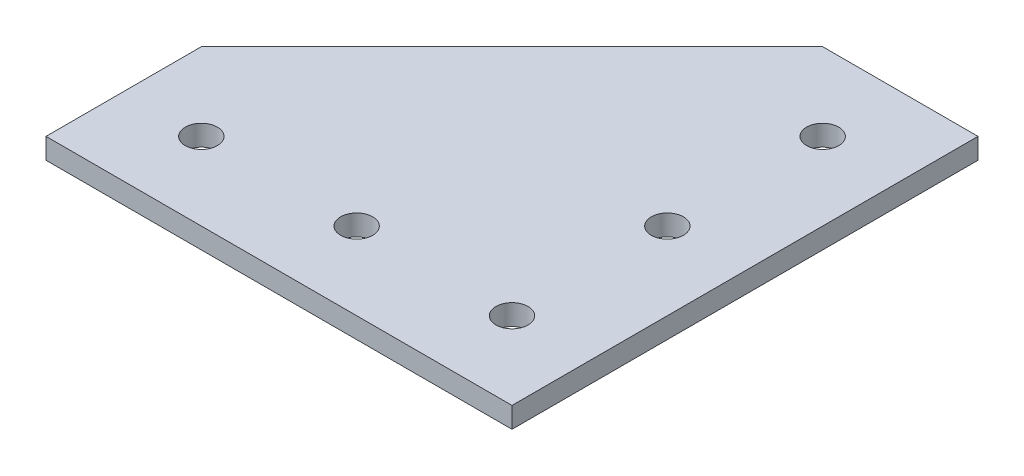
ISO-10303-21;
HEADER;
FILE_DESCRIPTION(('STEP AP214'),'2;1');
FILE_NAME('part.step','',(''),(''),'','','');
FILE_SCHEMA(('AUTOMOTIVE_DESIGN { 1 0 10303 214 1 1 1 1 }'));
ENDSEC;
DATA;
#1=APPLICATION_CONTEXT('core data for automotive mechanical design processes');
#2=APPLICATION_PROTOCOL_DEFINITION('international standard','automotive_design',2000,#1);
#3=PRODUCT_CONTEXT('',#1,'mechanical');
#4=PRODUCT('Part','Part','',(#3));
#5=PRODUCT_RELATED_PRODUCT_CATEGORY('part','',(#4));
#6=PRODUCT_DEFINITION_FORMATION('','',#4);
#7=PRODUCT_DEFINITION_CONTEXT('part definition',#1,'design');
#8=PRODUCT_DEFINITION('design','',#6,#7);
#9=PRODUCT_DEFINITION_SHAPE('','',#8);
#10=(LENGTH_UNIT() NAMED_UNIT(*) SI_UNIT(.MILLI.,.METRE.));
#11=(NAMED_UNIT(*) PLANE_ANGLE_UNIT() SI_UNIT($,.RADIAN.));
#12=(NAMED_UNIT(*) SI_UNIT($,.STERADIAN.) SOLID_ANGLE_UNIT());
#13=UNCERTAINTY_MEASURE_WITH_UNIT(LENGTH_MEASURE(1.E-05),#10,'distance_accuracy_value','');
#14=(GEOMETRIC_REPRESENTATION_CONTEXT(3) GLOBAL_UNCERTAINTY_ASSIGNED_CONTEXT((#13)) GLOBAL_UNIT_ASSIGNED_CONTEXT((#10,
#11,#12)) REPRESENTATION_CONTEXT('',''));
#15=CARTESIAN_POINT('',(0.,0.,0.));
#16=DIRECTION('',(0.,0.,1.));
#17=DIRECTION('',(1.,0.,0.));
#18=AXIS2_PLACEMENT_3D('',#15,#16,#17);
#19=CARTESIAN_POINT('',(0.,4.,0.));
#20=DIRECTION('',(0.,-1.,0.));
#21=DIRECTION('',(0.,0.,-1.));
#22=AXIS2_PLACEMENT_3D('',#19,#20,#21);
#23=PLANE('',#22);
#24=DIRECTION('',(-1.,0.,0.));
#25=VECTOR('',#24,1.);
#26=CARTESIAN_POINT('',(0.,4.,0.));
#27=LINE('',#26,#25);
#28=CARTESIAN_POINT('',(0.,4.,0.));
#29=VERTEX_POINT('',#28);
#30=CARTESIAN_POINT('',(-30.,4.,0.));
#31=VERTEX_POINT('',#30);
#32=EDGE_CURVE('E123',#29,#31,#27,.T.);
#33=ORIENTED_EDGE('',*,*,#32,.T.);
#34=DIRECTION('',(-0.707106781186547,0.,0.707106781186548));
#35=VECTOR('',#34,1.);
#36=CARTESIAN_POINT('',(-30.,4.,0.));
#37=LINE('',#36,#35);
#38=CARTESIAN_POINT('',(-90.,4.,60.));
#39=VERTEX_POINT('',#38);
#40=EDGE_CURVE('E90',#31,#39,#37,.T.);
#41=ORIENTED_EDGE('',*,*,#40,.T.);
#42=DIRECTION('',(0.,0.,1.));
#43=VECTOR('',#42,1.);
#44=CARTESIAN_POINT('',(-90.,4.,90.));
#45=LINE('',#44,#43);
#46=CARTESIAN_POINT('',(-90.,4.,90.));
#47=VERTEX_POINT('',#46);
#48=EDGE_CURVE('E94',#39,#47,#45,.T.);
#49=ORIENTED_EDGE('',*,*,#48,.T.);
#50=DIRECTION('',(1.,0.,0.));
#51=VECTOR('',#50,1.);
#52=CARTESIAN_POINT('',(0.,4.,90.));
#53=LINE('',#52,#51);
#54=CARTESIAN_POINT('',(0.,4.,90.));
#55=VERTEX_POINT('',#54);
#56=EDGE_CURVE('E98',#47,#55,#53,.T.);
#57=ORIENTED_EDGE('',*,*,#56,.T.);
#58=DIRECTION('',(0.,0.,-1.));
#59=VECTOR('',#58,1.);
#60=CARTESIAN_POINT('',(0.,4.,0.));
#61=LINE('',#60,#59);
#62=EDGE_CURVE('E56',#55,#29,#61,.T.);
#63=ORIENTED_EDGE('',*,*,#62,.T.);
#64=EDGE_LOOP('',(#33,#41,#49,#57,#63));
#65=FACE_BOUND('',#64,.T.);
#66=CARTESIAN_POINT('',(-15.,4.,15.));
#67=DIRECTION('',(0.,1.,0.));
#68=DIRECTION('',(0.,0.,1.));
#69=AXIS2_PLACEMENT_3D('',#66,#67,#68);
#70=CIRCLE('',#69,3.1);
#71=CARTESIAN_POINT('',(-15.,4.,18.1));
#72=VERTEX_POINT('',#71);
#73=EDGE_CURVE('E118',#72,#72,#70,.T.);
#74=ORIENTED_EDGE('',*,*,#73,.F.);
#75=EDGE_LOOP('',(#74));
#76=FACE_BOUND('',#75,.T.);
#77=CARTESIAN_POINT('',(-15.,4.,45.));
#78=DIRECTION('',(0.,1.,0.));
#79=DIRECTION('',(0.,0.,1.));
#80=AXIS2_PLACEMENT_3D('',#77,#78,#79);
#81=CIRCLE('',#80,3.1);
#82=CARTESIAN_POINT('',(-15.,4.,48.1));
#83=VERTEX_POINT('',#82);
#84=EDGE_CURVE('E192',#83,#83,#81,.T.);
#85=ORIENTED_EDGE('',*,*,#84,.F.);
#86=EDGE_LOOP('',(#85));
#87=FACE_BOUND('',#86,.T.);
#88=CARTESIAN_POINT('',(-15.,4.,75.));
#89=DIRECTION('',(0.,1.,0.));
#90=DIRECTION('',(0.,0.,1.));
#91=AXIS2_PLACEMENT_3D('',#88,#89,#90);
#92=CIRCLE('',#91,3.1);
#93=CARTESIAN_POINT('',(-15.,4.,78.1));
#94=VERTEX_POINT('',#93);
#95=EDGE_CURVE('E186',#94,#94,#92,.T.);
#96=ORIENTED_EDGE('',*,*,#95,.F.);
#97=EDGE_LOOP('',(#96));
#98=FACE_BOUND('',#97,.T.);
#99=CARTESIAN_POINT('',(-45.,4.,75.0000000000002));
#100=DIRECTION('',(0.,1.,0.));
#101=DIRECTION('',(0.,0.,1.));
#102=AXIS2_PLACEMENT_3D('',#99,#100,#101);
#103=CIRCLE('',#102,3.1);
#104=CARTESIAN_POINT('',(-45.,4.,78.1000000000002));
#105=VERTEX_POINT('',#104);
#106=EDGE_CURVE('E180',#105,#105,#103,.T.);
#107=ORIENTED_EDGE('',*,*,#106,.F.);
#108=EDGE_LOOP('',(#107));
#109=FACE_BOUND('',#108,.T.);
#110=CARTESIAN_POINT('',(-75.,4.,75.0000000000004));
#111=DIRECTION('',(0.,1.,0.));
#112=DIRECTION('',(0.,0.,1.));
#113=AXIS2_PLACEMENT_3D('',#110,#111,#112);
#114=CIRCLE('',#113,3.09999999999999);
#115=CARTESIAN_POINT('',(-75.,4.,78.1000000000004));
#116=VERTEX_POINT('',#115);
#117=EDGE_CURVE('E171',#116,#116,#114,.T.);
#118=ORIENTED_EDGE('',*,*,#117,.F.);
#119=EDGE_LOOP('',(#118));
#120=FACE_BOUND('',#119,.T.);
#121=ADVANCED_FACE('F39',(#65,#76,#87,#98,#109,#120),#23,.F.);
#122=CARTESIAN_POINT('',(0.,0.,0.));
#123=DIRECTION('',(0.,-1.,0.));
#124=DIRECTION('',(0.,0.,-1.));
#125=AXIS2_PLACEMENT_3D('',#122,#123,#124);
#126=PLANE('',#125);
#127=CARTESIAN_POINT('',(-45.,0.,75.0000000000002));
#128=DIRECTION('',(0.,1.,0.));
#129=DIRECTION('',(0.,0.,1.));
#130=AXIS2_PLACEMENT_3D('',#127,#128,#129);
#131=CIRCLE('',#130,3.1);
#132=CARTESIAN_POINT('',(-45.,0.,78.1000000000002));
#133=VERTEX_POINT('',#132);
#134=EDGE_CURVE('E177',#133,#133,#131,.T.);
#135=ORIENTED_EDGE('',*,*,#134,.T.);
#136=EDGE_LOOP('',(#135));
#137=FACE_BOUND('',#136,.T.);
#138=CARTESIAN_POINT('',(-15.,0.,45.));
#139=DIRECTION('',(0.,1.,0.));
#140=DIRECTION('',(0.,0.,1.));
#141=AXIS2_PLACEMENT_3D('',#138,#139,#140);
#142=CIRCLE('',#141,3.1);
#143=CARTESIAN_POINT('',(-15.,0.,48.1));
#144=VERTEX_POINT('',#143);
#145=EDGE_CURVE('E189',#144,#144,#142,.T.);
#146=ORIENTED_EDGE('',*,*,#145,.T.);
#147=EDGE_LOOP('',(#146));
#148=FACE_BOUND('',#147,.T.);
#149=DIRECTION('',(-1.,0.,0.));
#150=VECTOR('',#149,1.);
#151=CARTESIAN_POINT('',(0.,0.,0.));
#152=LINE('',#151,#150);
#153=CARTESIAN_POINT('',(0.,0.,0.));
#154=VERTEX_POINT('',#153);
#155=CARTESIAN_POINT('',(-30.,0.,0.));
#156=VERTEX_POINT('',#155);
#157=EDGE_CURVE('E114',#154,#156,#152,.T.);
#158=ORIENTED_EDGE('',*,*,#157,.F.);
#159=DIRECTION('',(0.,0.,-1.));
#160=VECTOR('',#159,1.);
#161=CARTESIAN_POINT('',(0.,0.,0.));
#162=LINE('',#161,#160);
#163=CARTESIAN_POINT('',(0.,0.,90.));
#164=VERTEX_POINT('',#163);
#165=EDGE_CURVE('E82',#164,#154,#162,.T.);
#166=ORIENTED_EDGE('',*,*,#165,.F.);
#167=DIRECTION('',(1.,0.,0.));
#168=VECTOR('',#167,1.);
#169=CARTESIAN_POINT('',(0.,0.,90.));
#170=LINE('',#169,#168);
#171=CARTESIAN_POINT('',(-90.,0.,90.));
#172=VERTEX_POINT('',#171);
#173=EDGE_CURVE('E76',#172,#164,#170,.T.);
#174=ORIENTED_EDGE('',*,*,#173,.F.);
#175=DIRECTION('',(0.,0.,1.));
#176=VECTOR('',#175,1.);
#177=CARTESIAN_POINT('',(-90.,0.,90.));
#178=LINE('',#177,#176);
#179=CARTESIAN_POINT('',(-90.,0.,60.));
#180=VERTEX_POINT('',#179);
#181=EDGE_CURVE('E105',#180,#172,#178,.T.);
#182=ORIENTED_EDGE('',*,*,#181,.F.);
#183=DIRECTION('',(-0.707106781186547,0.,0.707106781186548));
#184=VECTOR('',#183,1.);
#185=CARTESIAN_POINT('',(-30.,0.,0.));
#186=LINE('',#185,#184);
#187=EDGE_CURVE('E117',#156,#180,#186,.T.);
#188=ORIENTED_EDGE('',*,*,#187,.F.);
#189=EDGE_LOOP('',(#158,#166,#174,#182,#188));
#190=FACE_BOUND('',#189,.T.);
#191=CARTESIAN_POINT('',(-15.,0.,15.));
#192=DIRECTION('',(0.,1.,0.));
#193=DIRECTION('',(0.,0.,1.));
#194=AXIS2_PLACEMENT_3D('',#191,#192,#193);
#195=CIRCLE('',#194,3.1);
#196=CARTESIAN_POINT('',(-15.,0.,18.1));
#197=VERTEX_POINT('',#196);
#198=EDGE_CURVE('E195',#197,#197,#195,.T.);
#199=ORIENTED_EDGE('',*,*,#198,.T.);
#200=EDGE_LOOP('',(#199));
#201=FACE_BOUND('',#200,.T.);
#202=CARTESIAN_POINT('',(-15.,0.,75.));
#203=DIRECTION('',(0.,1.,0.));
#204=DIRECTION('',(0.,0.,1.));
#205=AXIS2_PLACEMENT_3D('',#202,#203,#204);
#206=CIRCLE('',#205,3.1);
#207=CARTESIAN_POINT('',(-15.,0.,78.1));
#208=VERTEX_POINT('',#207);
#209=EDGE_CURVE('E183',#208,#208,#206,.T.);
#210=ORIENTED_EDGE('',*,*,#209,.T.);
#211=EDGE_LOOP('',(#210));
#212=FACE_BOUND('',#211,.T.);
#213=CARTESIAN_POINT('',(-75.,0.,75.0000000000004));
#214=DIRECTION('',(0.,1.,0.));
#215=DIRECTION('',(0.,0.,1.));
#216=AXIS2_PLACEMENT_3D('',#213,#214,#215);
#217=CIRCLE('',#216,3.09999999999999);
#218=CARTESIAN_POINT('',(-75.,0.,78.1000000000004));
#219=VERTEX_POINT('',#218);
#220=EDGE_CURVE('E174',#219,#219,#217,.T.);
#221=ORIENTED_EDGE('',*,*,#220,.T.);
#222=EDGE_LOOP('',(#221));
#223=FACE_BOUND('',#222,.T.);
#224=ADVANCED_FACE('F127',(#137,#148,#190,#201,#212,#223),#126,.T.);
#225=CARTESIAN_POINT('',(0.,4.,0.));
#226=DIRECTION('',(0.,0.,1.));
#227=DIRECTION('',(1.,0.,0.));
#228=AXIS2_PLACEMENT_3D('',#225,#226,#227);
#229=PLANE('',#228);
#230=ORIENTED_EDGE('',*,*,#157,.T.);
#231=DIRECTION('',(0.,-1.,0.));
#232=VECTOR('',#231,1.);
#233=CARTESIAN_POINT('',(-30.,4.,0.));
#234=LINE('',#233,#232);
#235=EDGE_CURVE('E11',#31,#156,#234,.T.);
#236=ORIENTED_EDGE('',*,*,#235,.F.);
#237=ORIENTED_EDGE('',*,*,#32,.F.);
#238=DIRECTION('',(0.,-1.,0.));
#239=VECTOR('',#238,1.);
#240=CARTESIAN_POINT('',(0.,4.,0.));
#241=LINE('',#240,#239);
#242=EDGE_CURVE('E110',#29,#154,#241,.T.);
#243=ORIENTED_EDGE('',*,*,#242,.T.);
#244=EDGE_LOOP('',(#230,#236,#237,#243));
#245=FACE_BOUND('',#244,.T.);
#246=ADVANCED_FACE('F41',(#245),#229,.F.);
#247=CARTESIAN_POINT('',(-30.,4.,0.));
#248=DIRECTION('',(0.707106781186548,0.,0.707106781186547));
#249=DIRECTION('',(0.707106781186547,0.,-0.707106781186548));
#250=AXIS2_PLACEMENT_3D('',#247,#248,#249);
#251=PLANE('',#250);
#252=ORIENTED_EDGE('',*,*,#187,.T.);
#253=DIRECTION('',(0.,-1.,0.));
#254=VECTOR('',#253,1.);
#255=CARTESIAN_POINT('',(-90.,4.,60.));
#256=LINE('',#255,#254);
#257=EDGE_CURVE('E48',#39,#180,#256,.T.);
#258=ORIENTED_EDGE('',*,*,#257,.F.);
#259=ORIENTED_EDGE('',*,*,#40,.F.);
#260=ORIENTED_EDGE('',*,*,#235,.T.);
#261=EDGE_LOOP('',(#252,#258,#259,#260));
#262=FACE_BOUND('',#261,.T.);
#263=ADVANCED_FACE('F260',(#262),#251,.F.);
#264=CARTESIAN_POINT('',(-90.,4.,90.));
#265=DIRECTION('',(1.,0.,0.));
#266=DIRECTION('',(0.,0.,-1.));
#267=AXIS2_PLACEMENT_3D('',#264,#265,#266);
#268=PLANE('',#267);
#269=ORIENTED_EDGE('',*,*,#181,.T.);
#270=DIRECTION('',(0.,-1.,0.));
#271=VECTOR('',#270,1.);
#272=CARTESIAN_POINT('',(-90.,4.,90.));
#273=LINE('',#272,#271);
#274=EDGE_CURVE('E102',#47,#172,#273,.T.);
#275=ORIENTED_EDGE('',*,*,#274,.F.);
#276=ORIENTED_EDGE('',*,*,#48,.F.);
#277=ORIENTED_EDGE('',*,*,#257,.T.);
#278=EDGE_LOOP('',(#269,#275,#276,#277));
#279=FACE_BOUND('',#278,.T.);
#280=ADVANCED_FACE('F103',(#279),#268,.F.);
#281=CARTESIAN_POINT('',(0.,4.,90.));
#282=DIRECTION('',(0.,0.,-1.));
#283=DIRECTION('',(-1.,0.,0.));
#284=AXIS2_PLACEMENT_3D('',#281,#282,#283);
#285=PLANE('',#284);
#286=ORIENTED_EDGE('',*,*,#173,.T.);
#287=DIRECTION('',(0.,-1.,0.));
#288=VECTOR('',#287,1.);
#289=CARTESIAN_POINT('',(0.,4.,90.));
#290=LINE('',#289,#288);
#291=EDGE_CURVE('E106',#55,#164,#290,.T.);
#292=ORIENTED_EDGE('',*,*,#291,.F.);
#293=ORIENTED_EDGE('',*,*,#56,.F.);
#294=ORIENTED_EDGE('',*,*,#274,.T.);
#295=EDGE_LOOP('',(#286,#292,#293,#294));
#296=FACE_BOUND('',#295,.T.);
#297=ADVANCED_FACE('F108',(#296),#285,.F.);
#298=CARTESIAN_POINT('',(0.,4.,0.));
#299=DIRECTION('',(-1.,0.,0.));
#300=DIRECTION('',(0.,0.,1.));
#301=AXIS2_PLACEMENT_3D('',#298,#299,#300);
#302=PLANE('',#301);
#303=ORIENTED_EDGE('',*,*,#165,.T.);
#304=ORIENTED_EDGE('',*,*,#242,.F.);
#305=ORIENTED_EDGE('',*,*,#62,.F.);
#306=ORIENTED_EDGE('',*,*,#291,.T.);
#307=EDGE_LOOP('',(#303,#304,#305,#306));
#308=FACE_BOUND('',#307,.T.);
#309=ADVANCED_FACE('F132',(#308),#302,.F.);
#310=CARTESIAN_POINT('',(-15.,4.,15.));
#311=DIRECTION('',(0.,-1.,0.));
#312=DIRECTION('',(0.,0.,-1.));
#313=AXIS2_PLACEMENT_3D('',#310,#311,#312);
#314=CYLINDRICAL_SURFACE('',#313,3.1);
#315=ORIENTED_EDGE('',*,*,#73,.T.);
#316=EDGE_LOOP('',(#315));
#317=FACE_BOUND('',#316,.T.);
#318=ORIENTED_EDGE('',*,*,#198,.F.);
#319=EDGE_LOOP('',(#318));
#320=FACE_BOUND('',#319,.T.);
#321=ADVANCED_FACE('F134',(#317,#320),#314,.F.);
#322=CARTESIAN_POINT('',(-15.,4.,45.));
#323=DIRECTION('',(0.,-1.,0.));
#324=DIRECTION('',(0.,0.,-1.));
#325=AXIS2_PLACEMENT_3D('',#322,#323,#324);
#326=CYLINDRICAL_SURFACE('',#325,3.1);
#327=ORIENTED_EDGE('',*,*,#84,.T.);
#328=EDGE_LOOP('',(#327));
#329=FACE_BOUND('',#328,.T.);
#330=ORIENTED_EDGE('',*,*,#145,.F.);
#331=EDGE_LOOP('',(#330));
#332=FACE_BOUND('',#331,.T.);
#333=ADVANCED_FACE('F140',(#329,#332),#326,.F.);
#334=CARTESIAN_POINT('',(-15.,4.,75.));
#335=DIRECTION('',(0.,-1.,0.));
#336=DIRECTION('',(0.,0.,-1.));
#337=AXIS2_PLACEMENT_3D('',#334,#335,#336);
#338=CYLINDRICAL_SURFACE('',#337,3.1);
#339=ORIENTED_EDGE('',*,*,#95,.T.);
#340=EDGE_LOOP('',(#339));
#341=FACE_BOUND('',#340,.T.);
#342=ORIENTED_EDGE('',*,*,#209,.F.);
#343=EDGE_LOOP('',(#342));
#344=FACE_BOUND('',#343,.T.);
#345=ADVANCED_FACE('F154',(#341,#344),#338,.F.);
#346=CARTESIAN_POINT('',(-45.,4.,75.0000000000002));
#347=DIRECTION('',(0.,-1.,0.));
#348=DIRECTION('',(0.,0.,-1.));
#349=AXIS2_PLACEMENT_3D('',#346,#347,#348);
#350=CYLINDRICAL_SURFACE('',#349,3.1);
#351=ORIENTED_EDGE('',*,*,#106,.T.);
#352=EDGE_LOOP('',(#351));
#353=FACE_BOUND('',#352,.T.);
#354=ORIENTED_EDGE('',*,*,#134,.F.);
#355=EDGE_LOOP('',(#354));
#356=FACE_BOUND('',#355,.T.);
#357=ADVANCED_FACE('F158',(#353,#356),#350,.F.);
#358=CARTESIAN_POINT('',(-75.,4.,75.0000000000004));
#359=DIRECTION('',(0.,-1.,0.));
#360=DIRECTION('',(0.,0.,-1.));
#361=AXIS2_PLACEMENT_3D('',#358,#359,#360);
#362=CYLINDRICAL_SURFACE('',#361,3.09999999999999);
#363=ORIENTED_EDGE('',*,*,#117,.T.);
#364=EDGE_LOOP('',(#363));
#365=FACE_BOUND('',#364,.T.);
#366=ORIENTED_EDGE('',*,*,#220,.F.);
#367=EDGE_LOOP('',(#366));
#368=FACE_BOUND('',#367,.T.);
#369=ADVANCED_FACE('F162',(#365,#368),#362,.F.);
#370=CLOSED_SHELL('',(#121,#224,#246,#263,#280,#297,#309,#321,#333,#345,#357,#369));
#371=MANIFOLD_SOLID_BREP('B2',#370);
#372=ADVANCED_BREP_SHAPE_REPRESENTATION('',(#18,#371),#14);
#373=SHAPE_DEFINITION_REPRESENTATION(#9,#372);
ENDSEC;
END-ISO-10303-21;
